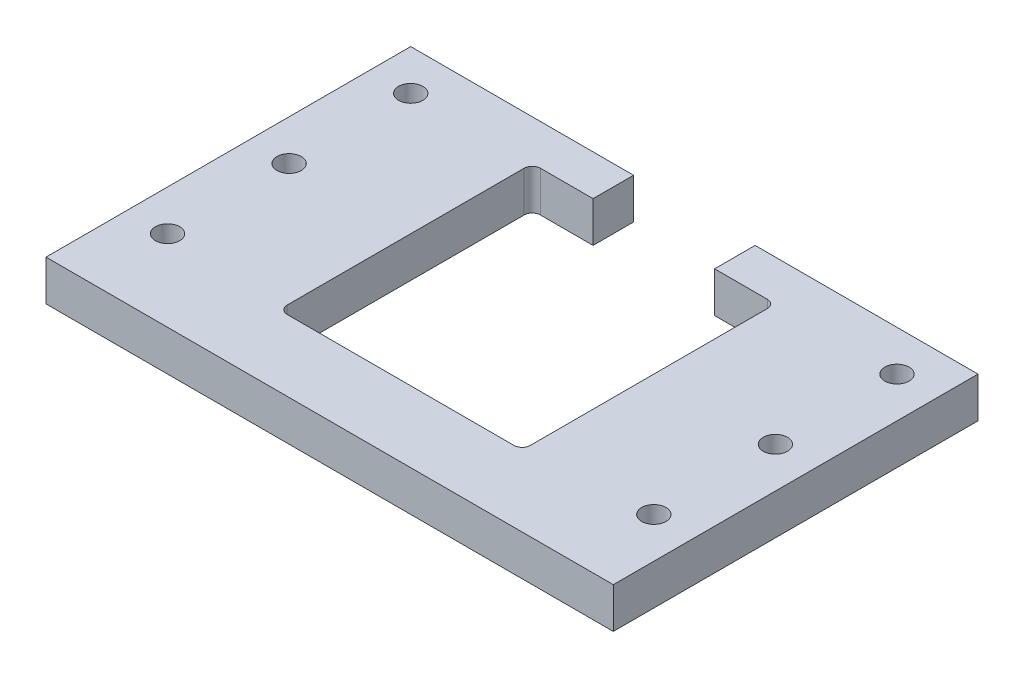
ISO-10303-21;
HEADER;
FILE_DESCRIPTION(('STEP AP214'),'2;1');
FILE_NAME('part.step','',(''),(''),'','','');
FILE_SCHEMA(('AUTOMOTIVE_DESIGN { 1 0 10303 214 1 1 1 1 }'));
ENDSEC;
DATA;
#1=APPLICATION_CONTEXT('core data for automotive mechanical design processes');
#2=APPLICATION_PROTOCOL_DEFINITION('international standard','automotive_design',2000,#1);
#3=PRODUCT_CONTEXT('',#1,'mechanical');
#4=PRODUCT('Part','Part','',(#3));
#5=PRODUCT_RELATED_PRODUCT_CATEGORY('part','',(#4));
#6=PRODUCT_DEFINITION_FORMATION('','',#4);
#7=PRODUCT_DEFINITION_CONTEXT('part definition',#1,'design');
#8=PRODUCT_DEFINITION('design','',#6,#7);
#9=PRODUCT_DEFINITION_SHAPE('','',#8);
#10=(LENGTH_UNIT() NAMED_UNIT(*) SI_UNIT(.MILLI.,.METRE.));
#11=(NAMED_UNIT(*) PLANE_ANGLE_UNIT() SI_UNIT($,.RADIAN.));
#12=(NAMED_UNIT(*) SI_UNIT($,.STERADIAN.) SOLID_ANGLE_UNIT());
#13=UNCERTAINTY_MEASURE_WITH_UNIT(LENGTH_MEASURE(1.E-05),#10,'distance_accuracy_value','');
#14=(GEOMETRIC_REPRESENTATION_CONTEXT(3) GLOBAL_UNCERTAINTY_ASSIGNED_CONTEXT((#13)) GLOBAL_UNIT_ASSIGNED_CONTEXT((#10,
#11,#12)) REPRESENTATION_CONTEXT('',''));
#15=CARTESIAN_POINT('',(0.,0.,0.));
#16=DIRECTION('',(0.,0.,1.));
#17=DIRECTION('',(1.,0.,0.));
#18=AXIS2_PLACEMENT_3D('',#15,#16,#17);
#19=CARTESIAN_POINT('',(108.577570855209,12.7,-91.9539837457078));
#20=DIRECTION('',(0.,1.,0.));
#21=DIRECTION('',(0.,0.,1.));
#22=AXIS2_PLACEMENT_3D('',#19,#20,#21);
#23=PLANE('',#22);
#24=CARTESIAN_POINT('',(149.217570855209,12.7,-56.3939837457078));
#25=DIRECTION('',(0.,1.,0.));
#26=DIRECTION('',(0.,0.,-1.));
#27=AXIS2_PLACEMENT_3D('',#24,#25,#26);
#28=CIRCLE('',#27,3.80999999999998);
#29=CARTESIAN_POINT('',(149.217570855209,12.7,-60.2039837457077));
#30=VERTEX_POINT('',#29);
#31=EDGE_CURVE('E404',#30,#30,#28,.T.);
#32=ORIENTED_EDGE('',*,*,#31,.F.);
#33=EDGE_LOOP('',(#32));
#34=FACE_BOUND('',#33,.T.);
#35=CARTESIAN_POINT('',(-3.18242914478994,12.7,-18.2939837457078));
#36=DIRECTION('',(0.,1.,0.));
#37=DIRECTION('',(0.,0.,1.));
#38=AXIS2_PLACEMENT_3D('',#35,#36,#37);
#39=CIRCLE('',#38,3.81);
#40=CARTESIAN_POINT('',(-3.18242914478994,12.7,-14.4839837457078));
#41=VERTEX_POINT('',#40);
#42=EDGE_CURVE('E420',#41,#41,#39,.T.);
#43=ORIENTED_EDGE('',*,*,#42,.F.);
#44=EDGE_LOOP('',(#43));
#45=FACE_BOUND('',#44,.T.);
#46=CARTESIAN_POINT('',(-3.18242914479074,12.7,-94.4939837457078));
#47=DIRECTION('',(0.,1.,0.));
#48=DIRECTION('',(0.,0.,1.));
#49=AXIS2_PLACEMENT_3D('',#46,#47,#48);
#50=CIRCLE('',#49,3.81);
#51=CARTESIAN_POINT('',(-3.18242914479074,12.7,-90.6839837457078));
#52=VERTEX_POINT('',#51);
#53=EDGE_CURVE('E194',#52,#52,#50,.T.);
#54=ORIENTED_EDGE('',*,*,#53,.F.);
#55=EDGE_LOOP('',(#54));
#56=FACE_BOUND('',#55,.T.);
#57=DIRECTION('',(0.,0.,1.));
#58=VECTOR('',#57,1.);
#59=CARTESIAN_POINT('',(-15.8824291447907,12.7,-107.193983745708));
#60=LINE('',#59,#58);
#61=CARTESIAN_POINT('',(-15.8824291447907,12.7,-107.193983745708));
#62=VERTEX_POINT('',#61);
#63=CARTESIAN_POINT('',(-15.8824291447907,12.7,7.10601625429223));
#64=VERTEX_POINT('',#63);
#65=EDGE_CURVE('E236',#62,#64,#60,.T.);
#66=ORIENTED_EDGE('',*,*,#65,.T.);
#67=DIRECTION('',(1.,0.,0.));
#68=VECTOR('',#67,1.);
#69=CARTESIAN_POINT('',(-15.8824291447907,12.7,7.10601625429223));
#70=LINE('',#69,#68);
#71=CARTESIAN_POINT('',(161.917570855209,12.7,7.10601625429223));
#72=VERTEX_POINT('',#71);
#73=EDGE_CURVE('E124',#64,#72,#70,.T.);
#74=ORIENTED_EDGE('',*,*,#73,.T.);
#75=DIRECTION('',(0.,0.,-1.));
#76=VECTOR('',#75,1.);
#77=CARTESIAN_POINT('',(161.917570855209,12.7,-107.193983745708));
#78=LINE('',#77,#76);
#79=CARTESIAN_POINT('',(161.917570855209,12.7,-107.193983745708));
#80=VERTEX_POINT('',#79);
#81=EDGE_CURVE('E289',#72,#80,#78,.T.);
#82=ORIENTED_EDGE('',*,*,#81,.T.);
#83=DIRECTION('',(-1.,0.,0.));
#84=VECTOR('',#83,1.);
#85=CARTESIAN_POINT('',(92.0675708552092,12.7,-107.193983745708));
#86=LINE('',#85,#84);
#87=CARTESIAN_POINT('',(92.0675708552092,12.7,-107.193983745708));
#88=VERTEX_POINT('',#87);
#89=EDGE_CURVE('E309',#80,#88,#86,.T.);
#90=ORIENTED_EDGE('',*,*,#89,.T.);
#91=DIRECTION('',(0.,0.,1.));
#92=VECTOR('',#91,1.);
#93=CARTESIAN_POINT('',(92.0675708552092,12.7,-94.4939837457078));
#94=LINE('',#93,#92);
#95=CARTESIAN_POINT('',(92.0675708552092,12.7,-94.4939837457078));
#96=VERTEX_POINT('',#95);
#97=EDGE_CURVE('E305',#88,#96,#94,.T.);
#98=ORIENTED_EDGE('',*,*,#97,.T.);
#99=DIRECTION('',(1.,0.,0.));
#100=VECTOR('',#99,1.);
#101=CARTESIAN_POINT('',(108.577570855209,12.7,-94.4939837457078));
#102=LINE('',#101,#100);
#103=CARTESIAN_POINT('',(108.577570855209,12.7,-94.4939837457078));
#104=VERTEX_POINT('',#103);
#105=EDGE_CURVE('E308',#96,#104,#102,.T.);
#106=ORIENTED_EDGE('',*,*,#105,.T.);
#107=CARTESIAN_POINT('',(108.577570855209,12.7,-91.9539837457078));
#108=DIRECTION('',(0.,-1.,0.));
#109=DIRECTION('',(0.,0.,1.));
#110=AXIS2_PLACEMENT_3D('',#107,#108,#109);
#111=CIRCLE('',#110,2.54);
#112=CARTESIAN_POINT('',(111.117570855209,12.7,-91.9539837457077));
#113=VERTEX_POINT('',#112);
#114=EDGE_CURVE('E313',#104,#113,#111,.T.);
#115=ORIENTED_EDGE('',*,*,#114,.T.);
#116=DIRECTION('',(0.,0.,1.));
#117=VECTOR('',#116,1.);
#118=CARTESIAN_POINT('',(111.117570855209,12.7,-17.6589837457078));
#119=LINE('',#118,#117);
#120=CARTESIAN_POINT('',(111.117570855209,12.7,-17.6589837457078));
#121=VERTEX_POINT('',#120);
#122=EDGE_CURVE('E320',#113,#121,#119,.T.);
#123=ORIENTED_EDGE('',*,*,#122,.T.);
#124=CARTESIAN_POINT('',(108.577570855209,12.7,-17.6589837457078));
#125=DIRECTION('',(0.,-1.,0.));
#126=DIRECTION('',(0.,0.,1.));
#127=AXIS2_PLACEMENT_3D('',#124,#125,#126);
#128=CIRCLE('',#127,2.54);
#129=CARTESIAN_POINT('',(108.577570855209,12.7,-15.1189837457078));
#130=VERTEX_POINT('',#129);
#131=EDGE_CURVE('E323',#121,#130,#128,.T.);
#132=ORIENTED_EDGE('',*,*,#131,.T.);
#133=DIRECTION('',(-1.,0.,0.));
#134=VECTOR('',#133,1.);
#135=CARTESIAN_POINT('',(108.577570855209,12.7,-15.1189837457078));
#136=LINE('',#135,#134);
#137=CARTESIAN_POINT('',(37.4575708552093,12.7,-15.1189837457077));
#138=VERTEX_POINT('',#137);
#139=EDGE_CURVE('E326',#130,#138,#136,.T.);
#140=ORIENTED_EDGE('',*,*,#139,.T.);
#141=CARTESIAN_POINT('',(37.4575708552092,12.7,-17.6589837457077));
#142=DIRECTION('',(0.,-1.,0.));
#143=DIRECTION('',(0.,0.,-1.));
#144=AXIS2_PLACEMENT_3D('',#141,#142,#143);
#145=CIRCLE('',#144,2.54);
#146=CARTESIAN_POINT('',(34.9175708552092,12.7,-17.6589837457078));
#147=VERTEX_POINT('',#146);
#148=EDGE_CURVE('E329',#138,#147,#145,.T.);
#149=ORIENTED_EDGE('',*,*,#148,.T.);
#150=DIRECTION('',(0.,0.,-1.));
#151=VECTOR('',#150,1.);
#152=CARTESIAN_POINT('',(34.9175708552092,12.7,-17.6589837457078));
#153=LINE('',#152,#151);
#154=CARTESIAN_POINT('',(34.9175708552092,12.7,-91.9539837457077));
#155=VERTEX_POINT('',#154);
#156=EDGE_CURVE('E332',#147,#155,#153,.T.);
#157=ORIENTED_EDGE('',*,*,#156,.T.);
#158=CARTESIAN_POINT('',(37.4575708552092,12.7,-91.9539837457077));
#159=DIRECTION('',(0.,-1.,0.));
#160=DIRECTION('',(0.,0.,1.));
#161=AXIS2_PLACEMENT_3D('',#158,#159,#160);
#162=CIRCLE('',#161,2.54);
#163=CARTESIAN_POINT('',(37.4575708552093,12.7,-94.4939837457078));
#164=VERTEX_POINT('',#163);
#165=EDGE_CURVE('E167',#155,#164,#162,.T.);
#166=ORIENTED_EDGE('',*,*,#165,.T.);
#167=DIRECTION('',(1.,0.,0.));
#168=VECTOR('',#167,1.);
#169=CARTESIAN_POINT('',(53.9675708552092,12.7,-94.4939837457078));
#170=LINE('',#169,#168);
#171=CARTESIAN_POINT('',(53.9675708552092,12.7,-94.4939837457078));
#172=VERTEX_POINT('',#171);
#173=EDGE_CURVE('E161',#164,#172,#170,.T.);
#174=ORIENTED_EDGE('',*,*,#173,.T.);
#175=DIRECTION('',(0.,0.,-1.));
#176=VECTOR('',#175,1.);
#177=CARTESIAN_POINT('',(53.9675708552092,12.7,-94.4939837457078));
#178=LINE('',#177,#176);
#179=CARTESIAN_POINT('',(53.9675708552092,12.7,-107.193983745708));
#180=VERTEX_POINT('',#179);
#181=EDGE_CURVE('E165',#172,#180,#178,.T.);
#182=ORIENTED_EDGE('',*,*,#181,.T.);
#183=DIRECTION('',(-1.,0.,0.));
#184=VECTOR('',#183,1.);
#185=CARTESIAN_POINT('',(-15.8824291447907,12.7,-107.193983745708));
#186=LINE('',#185,#184);
#187=EDGE_CURVE('E57',#180,#62,#186,.T.);
#188=ORIENTED_EDGE('',*,*,#187,.T.);
#189=EDGE_LOOP('',(#66,#74,#82,#90,#98,#106,#115,#123,#132,#140,#149,#157,#166,#174,#182,#188));
#190=FACE_BOUND('',#189,.T.);
#191=CARTESIAN_POINT('',(-3.18242914479034,12.7,-56.3939837457078));
#192=DIRECTION('',(0.,1.,0.));
#193=DIRECTION('',(0.,0.,1.));
#194=AXIS2_PLACEMENT_3D('',#191,#192,#193);
#195=CIRCLE('',#194,3.81);
#196=CARTESIAN_POINT('',(-3.18242914479034,12.7,-52.5839837457078));
#197=VERTEX_POINT('',#196);
#198=EDGE_CURVE('E428',#197,#197,#195,.T.);
#199=ORIENTED_EDGE('',*,*,#198,.F.);
#200=EDGE_LOOP('',(#199));
#201=FACE_BOUND('',#200,.T.);
#202=CARTESIAN_POINT('',(149.217570855209,12.7,-94.4939837457078));
#203=DIRECTION('',(0.,1.,0.));
#204=DIRECTION('',(0.,0.,-1.));
#205=AXIS2_PLACEMENT_3D('',#202,#203,#204);
#206=CIRCLE('',#205,3.80999999999999);
#207=CARTESIAN_POINT('',(149.217570855209,12.7,-98.3039837457077));
#208=VERTEX_POINT('',#207);
#209=EDGE_CURVE('E412',#208,#208,#206,.T.);
#210=ORIENTED_EDGE('',*,*,#209,.F.);
#211=EDGE_LOOP('',(#210));
#212=FACE_BOUND('',#211,.T.);
#213=CARTESIAN_POINT('',(149.217570855208,12.7,-18.2939837457078));
#214=DIRECTION('',(0.,1.,0.));
#215=DIRECTION('',(0.,0.,-1.));
#216=AXIS2_PLACEMENT_3D('',#213,#214,#215);
#217=CIRCLE('',#216,3.81000000000001);
#218=CARTESIAN_POINT('',(149.217570855208,12.7,-22.1039837457078));
#219=VERTEX_POINT('',#218);
#220=EDGE_CURVE('E393',#219,#219,#217,.T.);
#221=ORIENTED_EDGE('',*,*,#220,.F.);
#222=EDGE_LOOP('',(#221));
#223=FACE_BOUND('',#222,.T.);
#224=ADVANCED_FACE('F39',(#34,#45,#56,#190,#201,#212,#223),#23,.T.);
#225=CARTESIAN_POINT('',(108.577570855209,0.,-91.9539837457078));
#226=DIRECTION('',(0.,1.,0.));
#227=DIRECTION('',(0.,0.,1.));
#228=AXIS2_PLACEMENT_3D('',#225,#226,#227);
#229=PLANE('',#228);
#230=DIRECTION('',(0.,0.,1.));
#231=VECTOR('',#230,1.);
#232=CARTESIAN_POINT('',(-15.8824291447907,0.,-107.193983745708));
#233=LINE('',#232,#231);
#234=CARTESIAN_POINT('',(-15.8824291447907,0.,-107.193983745708));
#235=VERTEX_POINT('',#234);
#236=CARTESIAN_POINT('',(-15.8824291447907,0.,7.10601625429223));
#237=VERTEX_POINT('',#236);
#238=EDGE_CURVE('E189',#235,#237,#233,.T.);
#239=ORIENTED_EDGE('',*,*,#238,.F.);
#240=DIRECTION('',(-1.,0.,0.));
#241=VECTOR('',#240,1.);
#242=CARTESIAN_POINT('',(-15.8824291447907,0.,-107.193983745708));
#243=LINE('',#242,#241);
#244=CARTESIAN_POINT('',(53.9675708552092,0.,-107.193983745708));
#245=VERTEX_POINT('',#244);
#246=EDGE_CURVE('E116',#245,#235,#243,.T.);
#247=ORIENTED_EDGE('',*,*,#246,.F.);
#248=DIRECTION('',(0.,0.,-1.));
#249=VECTOR('',#248,1.);
#250=CARTESIAN_POINT('',(53.9675708552092,0.,-94.4939837457078));
#251=LINE('',#250,#249);
#252=CARTESIAN_POINT('',(53.9675708552092,0.,-94.4939837457078));
#253=VERTEX_POINT('',#252);
#254=EDGE_CURVE('E110',#253,#245,#251,.T.);
#255=ORIENTED_EDGE('',*,*,#254,.F.);
#256=DIRECTION('',(1.,0.,0.));
#257=VECTOR('',#256,1.);
#258=CARTESIAN_POINT('',(53.9675708552092,0.,-94.4939837457078));
#259=LINE('',#258,#257);
#260=CARTESIAN_POINT('',(37.4575708552093,0.,-94.4939837457078));
#261=VERTEX_POINT('',#260);
#262=EDGE_CURVE('E176',#261,#253,#259,.T.);
#263=ORIENTED_EDGE('',*,*,#262,.F.);
#264=CARTESIAN_POINT('',(37.4575708552092,0.,-91.9539837457077));
#265=DIRECTION('',(0.,-1.,0.));
#266=DIRECTION('',(0.,0.,1.));
#267=AXIS2_PLACEMENT_3D('',#264,#265,#266);
#268=CIRCLE('',#267,2.54);
#269=CARTESIAN_POINT('',(34.9175708552092,0.,-91.9539837457077));
#270=VERTEX_POINT('',#269);
#271=EDGE_CURVE('E227',#270,#261,#268,.T.);
#272=ORIENTED_EDGE('',*,*,#271,.F.);
#273=DIRECTION('',(0.,0.,-1.));
#274=VECTOR('',#273,1.);
#275=CARTESIAN_POINT('',(34.9175708552092,0.,-17.6589837457078));
#276=LINE('',#275,#274);
#277=CARTESIAN_POINT('',(34.9175708552092,0.,-17.6589837457078));
#278=VERTEX_POINT('',#277);
#279=EDGE_CURVE('E224',#278,#270,#276,.T.);
#280=ORIENTED_EDGE('',*,*,#279,.F.);
#281=CARTESIAN_POINT('',(37.4575708552092,0.,-17.6589837457077));
#282=DIRECTION('',(0.,-1.,0.));
#283=DIRECTION('',(0.,0.,-1.));
#284=AXIS2_PLACEMENT_3D('',#281,#282,#283);
#285=CIRCLE('',#284,2.54);
#286=CARTESIAN_POINT('',(37.4575708552093,0.,-15.1189837457077));
#287=VERTEX_POINT('',#286);
#288=EDGE_CURVE('E221',#287,#278,#285,.T.);
#289=ORIENTED_EDGE('',*,*,#288,.F.);
#290=DIRECTION('',(-1.,0.,0.));
#291=VECTOR('',#290,1.);
#292=CARTESIAN_POINT('',(108.577570855209,0.,-15.1189837457078));
#293=LINE('',#292,#291);
#294=CARTESIAN_POINT('',(108.577570855209,0.,-15.1189837457078));
#295=VERTEX_POINT('',#294);
#296=EDGE_CURVE('E218',#295,#287,#293,.T.);
#297=ORIENTED_EDGE('',*,*,#296,.F.);
#298=CARTESIAN_POINT('',(108.577570855209,0.,-17.6589837457078));
#299=DIRECTION('',(0.,-1.,0.));
#300=DIRECTION('',(0.,0.,1.));
#301=AXIS2_PLACEMENT_3D('',#298,#299,#300);
#302=CIRCLE('',#301,2.54);
#303=CARTESIAN_POINT('',(111.117570855209,0.,-17.6589837457078));
#304=VERTEX_POINT('',#303);
#305=EDGE_CURVE('E215',#304,#295,#302,.T.);
#306=ORIENTED_EDGE('',*,*,#305,.F.);
#307=DIRECTION('',(0.,0.,1.));
#308=VECTOR('',#307,1.);
#309=CARTESIAN_POINT('',(111.117570855209,0.,-17.6589837457078));
#310=LINE('',#309,#308);
#311=CARTESIAN_POINT('',(111.117570855209,0.,-91.9539837457077));
#312=VERTEX_POINT('',#311);
#313=EDGE_CURVE('E212',#312,#304,#310,.T.);
#314=ORIENTED_EDGE('',*,*,#313,.F.);
#315=CARTESIAN_POINT('',(108.577570855209,0.,-91.9539837457078));
#316=DIRECTION('',(0.,-1.,0.));
#317=DIRECTION('',(0.,0.,1.));
#318=AXIS2_PLACEMENT_3D('',#315,#316,#317);
#319=CIRCLE('',#318,2.54);
#320=CARTESIAN_POINT('',(108.577570855209,0.,-94.4939837457078));
#321=VERTEX_POINT('',#320);
#322=EDGE_CURVE('E209',#321,#312,#319,.T.);
#323=ORIENTED_EDGE('',*,*,#322,.F.);
#324=DIRECTION('',(1.,0.,0.));
#325=VECTOR('',#324,1.);
#326=CARTESIAN_POINT('',(108.577570855209,0.,-94.4939837457078));
#327=LINE('',#326,#325);
#328=CARTESIAN_POINT('',(92.0675708552092,0.,-94.4939837457078));
#329=VERTEX_POINT('',#328);
#330=EDGE_CURVE('E206',#329,#321,#327,.T.);
#331=ORIENTED_EDGE('',*,*,#330,.F.);
#332=DIRECTION('',(0.,0.,1.));
#333=VECTOR('',#332,1.);
#334=CARTESIAN_POINT('',(92.0675708552092,0.,-94.4939837457078));
#335=LINE('',#334,#333);
#336=CARTESIAN_POINT('',(92.0675708552092,0.,-107.193983745708));
#337=VERTEX_POINT('',#336);
#338=EDGE_CURVE('E203',#337,#329,#335,.T.);
#339=ORIENTED_EDGE('',*,*,#338,.F.);
#340=DIRECTION('',(-1.,0.,0.));
#341=VECTOR('',#340,1.);
#342=CARTESIAN_POINT('',(92.0675708552092,0.,-107.193983745708));
#343=LINE('',#342,#341);
#344=CARTESIAN_POINT('',(161.917570855209,0.,-107.193983745708));
#345=VERTEX_POINT('',#344);
#346=EDGE_CURVE('E200',#345,#337,#343,.T.);
#347=ORIENTED_EDGE('',*,*,#346,.F.);
#348=DIRECTION('',(0.,0.,-1.));
#349=VECTOR('',#348,1.);
#350=CARTESIAN_POINT('',(161.917570855209,0.,-107.193983745708));
#351=LINE('',#350,#349);
#352=CARTESIAN_POINT('',(161.917570855209,0.,7.10601625429223));
#353=VERTEX_POINT('',#352);
#354=EDGE_CURVE('E197',#353,#345,#351,.T.);
#355=ORIENTED_EDGE('',*,*,#354,.F.);
#356=DIRECTION('',(1.,0.,0.));
#357=VECTOR('',#356,1.);
#358=CARTESIAN_POINT('',(-15.8824291447907,0.,7.10601625429223));
#359=LINE('',#358,#357);
#360=EDGE_CURVE('E193',#237,#353,#359,.T.);
#361=ORIENTED_EDGE('',*,*,#360,.F.);
#362=EDGE_LOOP('',(#239,#247,#255,#263,#272,#280,#289,#297,#306,#314,#323,#331,#339,#347,#355,#361));
#363=FACE_BOUND('',#362,.T.);
#364=CARTESIAN_POINT('',(-3.18242914479074,0.,-94.4939837457078));
#365=DIRECTION('',(0.,1.,0.));
#366=DIRECTION('',(0.,0.,1.));
#367=AXIS2_PLACEMENT_3D('',#364,#365,#366);
#368=CIRCLE('',#367,3.81);
#369=CARTESIAN_POINT('',(-3.18242914479074,0.,-90.6839837457078));
#370=VERTEX_POINT('',#369);
#371=EDGE_CURVE('E432',#370,#370,#368,.T.);
#372=ORIENTED_EDGE('',*,*,#371,.T.);
#373=EDGE_LOOP('',(#372));
#374=FACE_BOUND('',#373,.T.);
#375=CARTESIAN_POINT('',(-3.18242914479034,0.,-56.3939837457078));
#376=DIRECTION('',(0.,1.,0.));
#377=DIRECTION('',(0.,0.,1.));
#378=AXIS2_PLACEMENT_3D('',#375,#376,#377);
#379=CIRCLE('',#378,3.81);
#380=CARTESIAN_POINT('',(-3.18242914479034,0.,-52.5839837457078));
#381=VERTEX_POINT('',#380);
#382=EDGE_CURVE('E424',#381,#381,#379,.T.);
#383=ORIENTED_EDGE('',*,*,#382,.T.);
#384=EDGE_LOOP('',(#383));
#385=FACE_BOUND('',#384,.T.);
#386=CARTESIAN_POINT('',(-3.18242914478994,0.,-18.2939837457078));
#387=DIRECTION('',(0.,1.,0.));
#388=DIRECTION('',(0.,0.,1.));
#389=AXIS2_PLACEMENT_3D('',#386,#387,#388);
#390=CIRCLE('',#389,3.81);
#391=CARTESIAN_POINT('',(-3.18242914478994,0.,-14.4839837457078));
#392=VERTEX_POINT('',#391);
#393=EDGE_CURVE('E416',#392,#392,#390,.T.);
#394=ORIENTED_EDGE('',*,*,#393,.T.);
#395=EDGE_LOOP('',(#394));
#396=FACE_BOUND('',#395,.T.);
#397=CARTESIAN_POINT('',(149.217570855209,0.,-94.4939837457078));
#398=DIRECTION('',(0.,1.,0.));
#399=DIRECTION('',(0.,0.,-1.));
#400=AXIS2_PLACEMENT_3D('',#397,#398,#399);
#401=CIRCLE('',#400,3.80999999999999);
#402=CARTESIAN_POINT('',(149.217570855209,0.,-98.3039837457077));
#403=VERTEX_POINT('',#402);
#404=EDGE_CURVE('E408',#403,#403,#401,.T.);
#405=ORIENTED_EDGE('',*,*,#404,.T.);
#406=EDGE_LOOP('',(#405));
#407=FACE_BOUND('',#406,.T.);
#408=CARTESIAN_POINT('',(149.217570855209,0.,-56.3939837457078));
#409=DIRECTION('',(0.,1.,0.));
#410=DIRECTION('',(0.,0.,-1.));
#411=AXIS2_PLACEMENT_3D('',#408,#409,#410);
#412=CIRCLE('',#411,3.80999999999998);
#413=CARTESIAN_POINT('',(149.217570855209,0.,-60.2039837457077));
#414=VERTEX_POINT('',#413);
#415=EDGE_CURVE('E401',#414,#414,#412,.T.);
#416=ORIENTED_EDGE('',*,*,#415,.T.);
#417=EDGE_LOOP('',(#416));
#418=FACE_BOUND('',#417,.T.);
#419=CARTESIAN_POINT('',(149.217570855208,0.,-18.2939837457078));
#420=DIRECTION('',(0.,1.,0.));
#421=DIRECTION('',(0.,0.,-1.));
#422=AXIS2_PLACEMENT_3D('',#419,#420,#421);
#423=CIRCLE('',#422,3.81000000000001);
#424=CARTESIAN_POINT('',(149.217570855208,0.,-22.1039837457078));
#425=VERTEX_POINT('',#424);
#426=EDGE_CURVE('E396',#425,#425,#423,.T.);
#427=ORIENTED_EDGE('',*,*,#426,.T.);
#428=EDGE_LOOP('',(#427));
#429=FACE_BOUND('',#428,.T.);
#430=ADVANCED_FACE('F293',(#363,#374,#385,#396,#407,#418,#429),#229,.F.);
#431=CARTESIAN_POINT('',(-15.8824291447907,12.7,-107.193983745708));
#432=DIRECTION('',(1.,0.,0.));
#433=DIRECTION('',(0.,0.,-1.));
#434=AXIS2_PLACEMENT_3D('',#431,#432,#433);
#435=PLANE('',#434);
#436=ORIENTED_EDGE('',*,*,#238,.T.);
#437=DIRECTION('',(0.,-1.,0.));
#438=VECTOR('',#437,1.);
#439=CARTESIAN_POINT('',(-15.8824291447907,12.7,7.10601625429223));
#440=LINE('',#439,#438);
#441=EDGE_CURVE('E11',#64,#237,#440,.T.);
#442=ORIENTED_EDGE('',*,*,#441,.F.);
#443=ORIENTED_EDGE('',*,*,#65,.F.);
#444=DIRECTION('',(0.,-1.,0.));
#445=VECTOR('',#444,1.);
#446=CARTESIAN_POINT('',(-15.8824291447907,12.7,-107.193983745708));
#447=LINE('',#446,#445);
#448=EDGE_CURVE('E185',#62,#235,#447,.T.);
#449=ORIENTED_EDGE('',*,*,#448,.T.);
#450=EDGE_LOOP('',(#436,#442,#443,#449));
#451=FACE_BOUND('',#450,.T.);
#452=ADVANCED_FACE('F41',(#451),#435,.F.);
#453=CARTESIAN_POINT('',(-15.8824291447907,12.7,7.10601625429223));
#454=DIRECTION('',(0.,0.,-1.));
#455=DIRECTION('',(-1.,0.,0.));
#456=AXIS2_PLACEMENT_3D('',#453,#454,#455);
#457=PLANE('',#456);
#458=ORIENTED_EDGE('',*,*,#360,.T.);
#459=DIRECTION('',(0.,-1.,0.));
#460=VECTOR('',#459,1.);
#461=CARTESIAN_POINT('',(161.917570855209,12.7,7.10601625429223));
#462=LINE('',#461,#460);
#463=EDGE_CURVE('E49',#72,#353,#462,.T.);
#464=ORIENTED_EDGE('',*,*,#463,.F.);
#465=ORIENTED_EDGE('',*,*,#73,.F.);
#466=ORIENTED_EDGE('',*,*,#441,.T.);
#467=EDGE_LOOP('',(#458,#464,#465,#466));
#468=FACE_BOUND('',#467,.T.);
#469=ADVANCED_FACE('F606',(#468),#457,.F.);
#470=CARTESIAN_POINT('',(161.917570855209,12.7,-107.193983745708));
#471=DIRECTION('',(-1.,0.,0.));
#472=DIRECTION('',(0.,0.,1.));
#473=AXIS2_PLACEMENT_3D('',#470,#471,#472);
#474=PLANE('',#473);
#475=ORIENTED_EDGE('',*,*,#354,.T.);
#476=DIRECTION('',(0.,-1.,0.));
#477=VECTOR('',#476,1.);
#478=CARTESIAN_POINT('',(161.917570855209,12.7,-107.193983745708));
#479=LINE('',#478,#477);
#480=EDGE_CURVE('E279',#80,#345,#479,.T.);
#481=ORIENTED_EDGE('',*,*,#480,.F.);
#482=ORIENTED_EDGE('',*,*,#81,.F.);
#483=ORIENTED_EDGE('',*,*,#463,.T.);
#484=EDGE_LOOP('',(#475,#481,#482,#483));
#485=FACE_BOUND('',#484,.T.);
#486=ADVANCED_FACE('F287',(#485),#474,.F.);
#487=CARTESIAN_POINT('',(92.0675708552092,12.7,-107.193983745708));
#488=DIRECTION('',(0.,0.,1.));
#489=DIRECTION('',(1.,0.,0.));
#490=AXIS2_PLACEMENT_3D('',#487,#488,#489);
#491=PLANE('',#490);
#492=ORIENTED_EDGE('',*,*,#346,.T.);
#493=DIRECTION('',(0.,-1.,0.));
#494=VECTOR('',#493,1.);
#495=CARTESIAN_POINT('',(92.0675708552092,12.7,-107.193983745708));
#496=LINE('',#495,#494);
#497=EDGE_CURVE('E275',#88,#337,#496,.T.);
#498=ORIENTED_EDGE('',*,*,#497,.F.);
#499=ORIENTED_EDGE('',*,*,#89,.F.);
#500=ORIENTED_EDGE('',*,*,#480,.T.);
#501=EDGE_LOOP('',(#492,#498,#499,#500));
#502=FACE_BOUND('',#501,.T.);
#503=ADVANCED_FACE('F299',(#502),#491,.F.);
#504=CARTESIAN_POINT('',(92.0675708552092,12.7,-94.4939837457078));
#505=DIRECTION('',(1.,0.,0.));
#506=DIRECTION('',(0.,0.,-1.));
#507=AXIS2_PLACEMENT_3D('',#504,#505,#506);
#508=PLANE('',#507);
#509=ORIENTED_EDGE('',*,*,#338,.T.);
#510=DIRECTION('',(0.,-1.,0.));
#511=VECTOR('',#510,1.);
#512=CARTESIAN_POINT('',(92.0675708552092,12.7,-94.4939837457078));
#513=LINE('',#512,#511);
#514=EDGE_CURVE('E271',#96,#329,#513,.T.);
#515=ORIENTED_EDGE('',*,*,#514,.F.);
#516=ORIENTED_EDGE('',*,*,#97,.F.);
#517=ORIENTED_EDGE('',*,*,#497,.T.);
#518=EDGE_LOOP('',(#509,#515,#516,#517));
#519=FACE_BOUND('',#518,.T.);
#520=ADVANCED_FACE('F303',(#519),#508,.F.);
#521=CARTESIAN_POINT('',(108.577570855209,12.7,-94.4939837457078));
#522=DIRECTION('',(0.,0.,-1.));
#523=DIRECTION('',(-1.,0.,0.));
#524=AXIS2_PLACEMENT_3D('',#521,#522,#523);
#525=PLANE('',#524);
#526=ORIENTED_EDGE('',*,*,#330,.T.);
#527=DIRECTION('',(0.,-1.,0.));
#528=VECTOR('',#527,1.);
#529=CARTESIAN_POINT('',(108.577570855209,12.7,-94.4939837457078));
#530=LINE('',#529,#528);
#531=EDGE_CURVE('E267',#104,#321,#530,.T.);
#532=ORIENTED_EDGE('',*,*,#531,.F.);
#533=ORIENTED_EDGE('',*,*,#105,.F.);
#534=ORIENTED_EDGE('',*,*,#514,.T.);
#535=EDGE_LOOP('',(#526,#532,#533,#534));
#536=FACE_BOUND('',#535,.T.);
#537=ADVANCED_FACE('F571',(#536),#525,.F.);
#538=CARTESIAN_POINT('',(108.577570855209,12.7,-91.9539837457078));
#539=DIRECTION('',(0.,-1.,0.));
#540=DIRECTION('',(0.,0.,-1.));
#541=AXIS2_PLACEMENT_3D('',#538,#539,#540);
#542=CYLINDRICAL_SURFACE('',#541,2.54);
#543=ORIENTED_EDGE('',*,*,#322,.T.);
#544=DIRECTION('',(0.,-1.,0.));
#545=VECTOR('',#544,1.);
#546=CARTESIAN_POINT('',(111.117570855209,12.7,-91.9539837457077));
#547=LINE('',#546,#545);
#548=EDGE_CURVE('E263',#113,#312,#547,.T.);
#549=ORIENTED_EDGE('',*,*,#548,.F.);
#550=ORIENTED_EDGE('',*,*,#114,.F.);
#551=ORIENTED_EDGE('',*,*,#531,.T.);
#552=EDGE_LOOP('',(#543,#549,#550,#551));
#553=FACE_BOUND('',#552,.T.);
#554=ADVANCED_FACE('F561',(#553),#542,.F.);
#555=CARTESIAN_POINT('',(111.117570855209,12.7,-17.6589837457078));
#556=DIRECTION('',(1.,0.,0.));
#557=DIRECTION('',(0.,0.,-1.));
#558=AXIS2_PLACEMENT_3D('',#555,#556,#557);
#559=PLANE('',#558);
#560=ORIENTED_EDGE('',*,*,#313,.T.);
#561=DIRECTION('',(0.,-1.,0.));
#562=VECTOR('',#561,1.);
#563=CARTESIAN_POINT('',(111.117570855209,12.7,-17.6589837457078));
#564=LINE('',#563,#562);
#565=EDGE_CURVE('E259',#121,#304,#564,.T.);
#566=ORIENTED_EDGE('',*,*,#565,.F.);
#567=ORIENTED_EDGE('',*,*,#122,.F.);
#568=ORIENTED_EDGE('',*,*,#548,.T.);
#569=EDGE_LOOP('',(#560,#566,#567,#568));
#570=FACE_BOUND('',#569,.T.);
#571=ADVANCED_FACE('F551',(#570),#559,.F.);
#572=CARTESIAN_POINT('',(108.577570855209,12.7,-17.6589837457078));
#573=DIRECTION('',(0.,-1.,0.));
#574=DIRECTION('',(0.,0.,-1.));
#575=AXIS2_PLACEMENT_3D('',#572,#573,#574);
#576=CYLINDRICAL_SURFACE('',#575,2.54);
#577=ORIENTED_EDGE('',*,*,#305,.T.);
#578=DIRECTION('',(0.,-1.,0.));
#579=VECTOR('',#578,1.);
#580=CARTESIAN_POINT('',(108.577570855209,12.7,-15.1189837457078));
#581=LINE('',#580,#579);
#582=EDGE_CURVE('E255',#130,#295,#581,.T.);
#583=ORIENTED_EDGE('',*,*,#582,.F.);
#584=ORIENTED_EDGE('',*,*,#131,.F.);
#585=ORIENTED_EDGE('',*,*,#565,.T.);
#586=EDGE_LOOP('',(#577,#583,#584,#585));
#587=FACE_BOUND('',#586,.T.);
#588=ADVANCED_FACE('F541',(#587),#576,.F.);
#589=CARTESIAN_POINT('',(108.577570855209,12.7,-15.1189837457078));
#590=DIRECTION('',(0.,0.,1.));
#591=DIRECTION('',(1.,0.,0.));
#592=AXIS2_PLACEMENT_3D('',#589,#590,#591);
#593=PLANE('',#592);
#594=ORIENTED_EDGE('',*,*,#296,.T.);
#595=DIRECTION('',(0.,-1.,0.));
#596=VECTOR('',#595,1.);
#597=CARTESIAN_POINT('',(37.4575708552093,12.7,-15.1189837457077));
#598=LINE('',#597,#596);
#599=EDGE_CURVE('E251',#138,#287,#598,.T.);
#600=ORIENTED_EDGE('',*,*,#599,.F.);
#601=ORIENTED_EDGE('',*,*,#139,.F.);
#602=ORIENTED_EDGE('',*,*,#582,.T.);
#603=EDGE_LOOP('',(#594,#600,#601,#602));
#604=FACE_BOUND('',#603,.T.);
#605=ADVANCED_FACE('F531',(#604),#593,.F.);
#606=CARTESIAN_POINT('',(37.4575708552092,12.7,-17.6589837457077));
#607=DIRECTION('',(0.,-1.,0.));
#608=DIRECTION('',(0.,0.,-1.));
#609=AXIS2_PLACEMENT_3D('',#606,#607,#608);
#610=CYLINDRICAL_SURFACE('',#609,2.54);
#611=ORIENTED_EDGE('',*,*,#288,.T.);
#612=DIRECTION('',(0.,-1.,0.));
#613=VECTOR('',#612,1.);
#614=CARTESIAN_POINT('',(34.9175708552092,12.7,-17.6589837457078));
#615=LINE('',#614,#613);
#616=EDGE_CURVE('E247',#147,#278,#615,.T.);
#617=ORIENTED_EDGE('',*,*,#616,.F.);
#618=ORIENTED_EDGE('',*,*,#148,.F.);
#619=ORIENTED_EDGE('',*,*,#599,.T.);
#620=EDGE_LOOP('',(#611,#617,#618,#619));
#621=FACE_BOUND('',#620,.T.);
#622=ADVANCED_FACE('F522',(#621),#610,.F.);
#623=CARTESIAN_POINT('',(34.9175708552092,12.7,-17.6589837457078));
#624=DIRECTION('',(-1.,0.,0.));
#625=DIRECTION('',(0.,0.,1.));
#626=AXIS2_PLACEMENT_3D('',#623,#624,#625);
#627=PLANE('',#626);
#628=ORIENTED_EDGE('',*,*,#279,.T.);
#629=DIRECTION('',(0.,-1.,0.));
#630=VECTOR('',#629,1.);
#631=CARTESIAN_POINT('',(34.9175708552092,12.7,-91.9539837457077));
#632=LINE('',#631,#630);
#633=EDGE_CURVE('E243',#155,#270,#632,.T.);
#634=ORIENTED_EDGE('',*,*,#633,.F.);
#635=ORIENTED_EDGE('',*,*,#156,.F.);
#636=ORIENTED_EDGE('',*,*,#616,.T.);
#637=EDGE_LOOP('',(#628,#634,#635,#636));
#638=FACE_BOUND('',#637,.T.);
#639=ADVANCED_FACE('F340',(#638),#627,.F.);
#640=CARTESIAN_POINT('',(37.4575708552092,12.7,-91.9539837457077));
#641=DIRECTION('',(0.,-1.,0.));
#642=DIRECTION('',(0.,0.,-1.));
#643=AXIS2_PLACEMENT_3D('',#640,#641,#642);
#644=CYLINDRICAL_SURFACE('',#643,2.54);
#645=ORIENTED_EDGE('',*,*,#271,.T.);
#646=DIRECTION('',(0.,-1.,0.));
#647=VECTOR('',#646,1.);
#648=CARTESIAN_POINT('',(37.4575708552093,12.7,-94.4939837457078));
#649=LINE('',#648,#647);
#650=EDGE_CURVE('E178',#164,#261,#649,.T.);
#651=ORIENTED_EDGE('',*,*,#650,.F.);
#652=ORIENTED_EDGE('',*,*,#165,.F.);
#653=ORIENTED_EDGE('',*,*,#633,.T.);
#654=EDGE_LOOP('',(#645,#651,#652,#653));
#655=FACE_BOUND('',#654,.T.);
#656=ADVANCED_FACE('F344',(#655),#644,.F.);
#657=CARTESIAN_POINT('',(53.9675708552092,12.7,-94.4939837457078));
#658=DIRECTION('',(0.,0.,-1.));
#659=DIRECTION('',(-1.,0.,0.));
#660=AXIS2_PLACEMENT_3D('',#657,#658,#659);
#661=PLANE('',#660);
#662=ORIENTED_EDGE('',*,*,#262,.T.);
#663=DIRECTION('',(0.,-1.,0.));
#664=VECTOR('',#663,1.);
#665=CARTESIAN_POINT('',(53.9675708552092,12.7,-94.4939837457078));
#666=LINE('',#665,#664);
#667=EDGE_CURVE('E173',#172,#253,#666,.T.);
#668=ORIENTED_EDGE('',*,*,#667,.F.);
#669=ORIENTED_EDGE('',*,*,#173,.F.);
#670=ORIENTED_EDGE('',*,*,#650,.T.);
#671=EDGE_LOOP('',(#662,#668,#669,#670));
#672=FACE_BOUND('',#671,.T.);
#673=ADVANCED_FACE('F174',(#672),#661,.F.);
#674=CARTESIAN_POINT('',(53.9675708552092,12.7,-94.4939837457078));
#675=DIRECTION('',(-1.,0.,0.));
#676=DIRECTION('',(0.,0.,1.));
#677=AXIS2_PLACEMENT_3D('',#674,#675,#676);
#678=PLANE('',#677);
#679=ORIENTED_EDGE('',*,*,#254,.T.);
#680=DIRECTION('',(0.,-1.,0.));
#681=VECTOR('',#680,1.);
#682=CARTESIAN_POINT('',(53.9675708552092,12.7,-107.193983745708));
#683=LINE('',#682,#681);
#684=EDGE_CURVE('E179',#180,#245,#683,.T.);
#685=ORIENTED_EDGE('',*,*,#684,.F.);
#686=ORIENTED_EDGE('',*,*,#181,.F.);
#687=ORIENTED_EDGE('',*,*,#667,.T.);
#688=EDGE_LOOP('',(#679,#685,#686,#687));
#689=FACE_BOUND('',#688,.T.);
#690=ADVANCED_FACE('F181',(#689),#678,.F.);
#691=CARTESIAN_POINT('',(-15.8824291447907,12.7,-107.193983745708));
#692=DIRECTION('',(0.,0.,1.));
#693=DIRECTION('',(1.,0.,0.));
#694=AXIS2_PLACEMENT_3D('',#691,#692,#693);
#695=PLANE('',#694);
#696=ORIENTED_EDGE('',*,*,#246,.T.);
#697=ORIENTED_EDGE('',*,*,#448,.F.);
#698=ORIENTED_EDGE('',*,*,#187,.F.);
#699=ORIENTED_EDGE('',*,*,#684,.T.);
#700=EDGE_LOOP('',(#696,#697,#698,#699));
#701=FACE_BOUND('',#700,.T.);
#702=ADVANCED_FACE('F348',(#701),#695,.F.);
#703=CARTESIAN_POINT('',(-3.18242914479074,12.7,-94.4939837457078));
#704=DIRECTION('',(0.,-1.,0.));
#705=DIRECTION('',(0.,0.,-1.));
#706=AXIS2_PLACEMENT_3D('',#703,#704,#705);
#707=CYLINDRICAL_SURFACE('',#706,3.81);
#708=ORIENTED_EDGE('',*,*,#53,.T.);
#709=EDGE_LOOP('',(#708));
#710=FACE_BOUND('',#709,.T.);
#711=ORIENTED_EDGE('',*,*,#371,.F.);
#712=EDGE_LOOP('',(#711));
#713=FACE_BOUND('',#712,.T.);
#714=ADVANCED_FACE('F350',(#710,#713),#707,.F.);
#715=CARTESIAN_POINT('',(-3.18242914479034,12.7,-56.3939837457078));
#716=DIRECTION('',(0.,-1.,0.));
#717=DIRECTION('',(0.,0.,-1.));
#718=AXIS2_PLACEMENT_3D('',#715,#716,#717);
#719=CYLINDRICAL_SURFACE('',#718,3.81);
#720=ORIENTED_EDGE('',*,*,#198,.T.);
#721=EDGE_LOOP('',(#720));
#722=FACE_BOUND('',#721,.T.);
#723=ORIENTED_EDGE('',*,*,#382,.F.);
#724=EDGE_LOOP('',(#723));
#725=FACE_BOUND('',#724,.T.);
#726=ADVANCED_FACE('F356',(#722,#725),#719,.F.);
#727=CARTESIAN_POINT('',(-3.18242914478994,12.7,-18.2939837457078));
#728=DIRECTION('',(0.,-1.,0.));
#729=DIRECTION('',(0.,0.,-1.));
#730=AXIS2_PLACEMENT_3D('',#727,#728,#729);
#731=CYLINDRICAL_SURFACE('',#730,3.81);
#732=ORIENTED_EDGE('',*,*,#42,.T.);
#733=EDGE_LOOP('',(#732));
#734=FACE_BOUND('',#733,.T.);
#735=ORIENTED_EDGE('',*,*,#393,.F.);
#736=EDGE_LOOP('',(#735));
#737=FACE_BOUND('',#736,.T.);
#738=ADVANCED_FACE('F372',(#734,#737),#731,.F.);
#739=CARTESIAN_POINT('',(149.217570855209,12.7,-94.4939837457078));
#740=DIRECTION('',(0.,-1.,0.));
#741=DIRECTION('',(0.,0.,-1.));
#742=AXIS2_PLACEMENT_3D('',#739,#740,#741);
#743=CYLINDRICAL_SURFACE('',#742,3.80999999999999);
#744=ORIENTED_EDGE('',*,*,#209,.T.);
#745=EDGE_LOOP('',(#744));
#746=FACE_BOUND('',#745,.T.);
#747=ORIENTED_EDGE('',*,*,#404,.F.);
#748=EDGE_LOOP('',(#747));
#749=FACE_BOUND('',#748,.T.);
#750=ADVANCED_FACE('F376',(#746,#749),#743,.F.);
#751=CARTESIAN_POINT('',(149.217570855209,12.7,-56.3939837457078));
#752=DIRECTION('',(0.,-1.,0.));
#753=DIRECTION('',(0.,0.,-1.));
#754=AXIS2_PLACEMENT_3D('',#751,#752,#753);
#755=CYLINDRICAL_SURFACE('',#754,3.80999999999998);
#756=ORIENTED_EDGE('',*,*,#31,.T.);
#757=EDGE_LOOP('',(#756));
#758=FACE_BOUND('',#757,.T.);
#759=ORIENTED_EDGE('',*,*,#415,.F.);
#760=EDGE_LOOP('',(#759));
#761=FACE_BOUND('',#760,.T.);
#762=ADVANCED_FACE('F380',(#758,#761),#755,.F.);
#763=CARTESIAN_POINT('',(149.217570855208,12.7,-18.2939837457078));
#764=DIRECTION('',(0.,-1.,0.));
#765=DIRECTION('',(0.,0.,-1.));
#766=AXIS2_PLACEMENT_3D('',#763,#764,#765);
#767=CYLINDRICAL_SURFACE('',#766,3.81000000000001);
#768=ORIENTED_EDGE('',*,*,#220,.T.);
#769=EDGE_LOOP('',(#768));
#770=FACE_BOUND('',#769,.T.);
#771=ORIENTED_EDGE('',*,*,#426,.F.);
#772=EDGE_LOOP('',(#771));
#773=FACE_BOUND('',#772,.T.);
#774=ADVANCED_FACE('F384',(#770,#773),#767,.F.);
#775=CLOSED_SHELL('',(#224,#430,#452,#469,#486,#503,#520,#537,#554,#571,#588,#605,#622,#639,
#656,#673,#690,#702,#714,#726,#738,#750,#762,#774));
#776=MANIFOLD_SOLID_BREP('B2',#775);
#777=ADVANCED_BREP_SHAPE_REPRESENTATION('',(#18,#776),#14);
#778=SHAPE_DEFINITION_REPRESENTATION(#9,#777);
ENDSEC;
END-ISO-10303-21;
